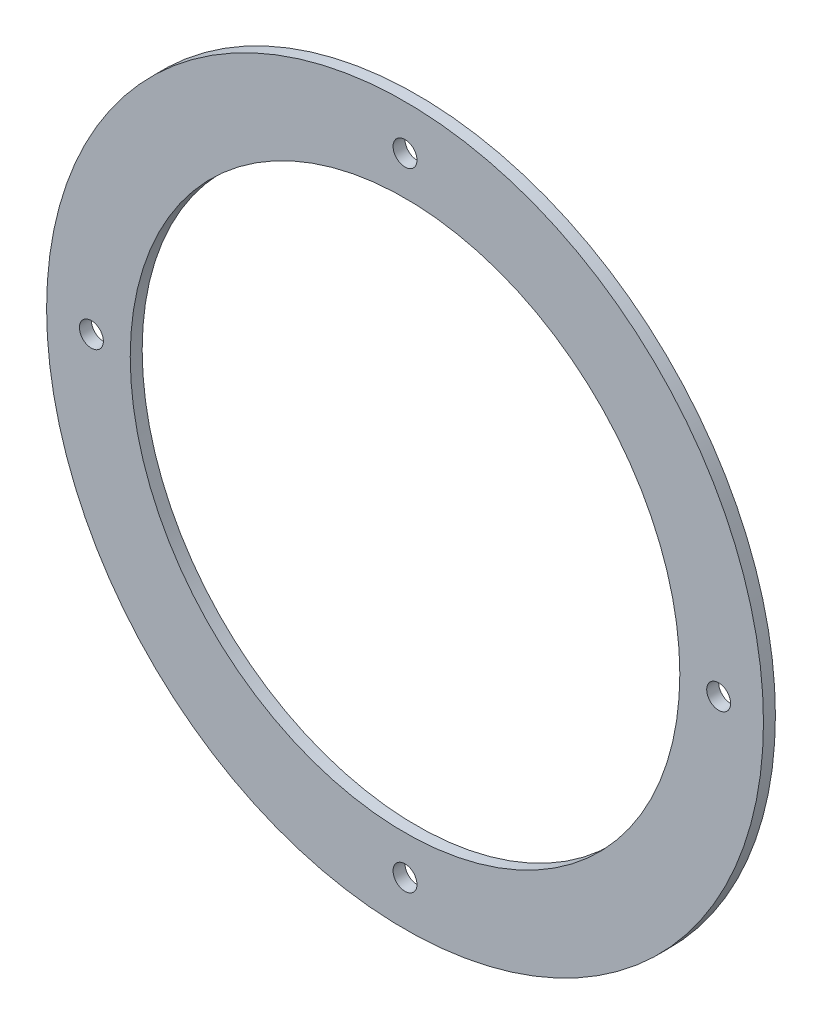
ISO-10303-21;
HEADER;
FILE_DESCRIPTION(('STEP AP214'),'2;1');
FILE_NAME('part.step','',(''),(''),'','','');
FILE_SCHEMA(('AUTOMOTIVE_DESIGN { 1 0 10303 214 1 1 1 1 }'));
ENDSEC;
DATA;
#1=APPLICATION_CONTEXT('core data for automotive mechanical design processes');
#2=APPLICATION_PROTOCOL_DEFINITION('international standard','automotive_design',2000,#1);
#3=PRODUCT_CONTEXT('',#1,'mechanical');
#4=PRODUCT('Part','Part','',(#3));
#5=PRODUCT_RELATED_PRODUCT_CATEGORY('part','',(#4));
#6=PRODUCT_DEFINITION_FORMATION('','',#4);
#7=PRODUCT_DEFINITION_CONTEXT('part definition',#1,'design');
#8=PRODUCT_DEFINITION('design','',#6,#7);
#9=PRODUCT_DEFINITION_SHAPE('','',#8);
#10=(LENGTH_UNIT() NAMED_UNIT(*) SI_UNIT(.MILLI.,.METRE.));
#11=(NAMED_UNIT(*) PLANE_ANGLE_UNIT() SI_UNIT($,.RADIAN.));
#12=(NAMED_UNIT(*) SI_UNIT($,.STERADIAN.) SOLID_ANGLE_UNIT());
#13=UNCERTAINTY_MEASURE_WITH_UNIT(LENGTH_MEASURE(1.E-05),#10,'distance_accuracy_value','');
#14=(GEOMETRIC_REPRESENTATION_CONTEXT(3) GLOBAL_UNCERTAINTY_ASSIGNED_CONTEXT((#13)) GLOBAL_UNIT_ASSIGNED_CONTEXT((#10,
#11,#12)) REPRESENTATION_CONTEXT('',''));
#15=CARTESIAN_POINT('',(0.,0.,0.));
#16=DIRECTION('',(0.,0.,1.));
#17=DIRECTION('',(1.,0.,0.));
#18=AXIS2_PLACEMENT_3D('',#15,#16,#17);
#19=CARTESIAN_POINT('',(0.,0.,2.));
#20=DIRECTION('',(0.,0.,1.));
#21=DIRECTION('',(1.,0.,0.));
#22=AXIS2_PLACEMENT_3D('',#19,#20,#21);
#23=PLANE('',#22);
#24=CARTESIAN_POINT('',(0.,-52.5,2.));
#25=DIRECTION('',(0.,0.,1.));
#26=DIRECTION('',(1.,0.,0.));
#27=AXIS2_PLACEMENT_3D('',#24,#25,#26);
#28=CIRCLE('',#27,2.);
#29=CARTESIAN_POINT('',(2.00000000000001,-52.5,2.));
#30=VERTEX_POINT('',#29);
#31=EDGE_CURVE('E63',#30,#30,#28,.T.);
#32=ORIENTED_EDGE('',*,*,#31,.F.);
#33=EDGE_LOOP('',(#32));
#34=FACE_BOUND('',#33,.T.);
#35=CARTESIAN_POINT('',(0.,52.5,2.));
#36=DIRECTION('',(0.,0.,1.));
#37=DIRECTION('',(1.,0.,0.));
#38=AXIS2_PLACEMENT_3D('',#35,#36,#37);
#39=CIRCLE('',#38,2.);
#40=CARTESIAN_POINT('',(2.,52.5,2.));
#41=VERTEX_POINT('',#40);
#42=EDGE_CURVE('E51',#41,#41,#39,.T.);
#43=ORIENTED_EDGE('',*,*,#42,.F.);
#44=EDGE_LOOP('',(#43));
#45=FACE_BOUND('',#44,.T.);
#46=CARTESIAN_POINT('',(-52.5,0.,2.));
#47=DIRECTION('',(0.,0.,1.));
#48=DIRECTION('',(1.,0.,0.));
#49=AXIS2_PLACEMENT_3D('',#46,#47,#48);
#50=CIRCLE('',#49,2.);
#51=CARTESIAN_POINT('',(-50.5,0.,2.));
#52=VERTEX_POINT('',#51);
#53=EDGE_CURVE('E11',#52,#52,#50,.T.);
#54=ORIENTED_EDGE('',*,*,#53,.F.);
#55=EDGE_LOOP('',(#54));
#56=FACE_BOUND('',#55,.T.);
#57=CARTESIAN_POINT('',(0.,0.,2.));
#58=DIRECTION('',(0.,0.,1.));
#59=DIRECTION('',(1.,0.,0.));
#60=AXIS2_PLACEMENT_3D('',#57,#58,#59);
#61=CIRCLE('',#60,46.);
#62=CARTESIAN_POINT('',(46.,0.,2.));
#63=VERTEX_POINT('',#62);
#64=EDGE_CURVE('E46',#63,#63,#61,.T.);
#65=ORIENTED_EDGE('',*,*,#64,.F.);
#66=EDGE_LOOP('',(#65));
#67=FACE_BOUND('',#66,.T.);
#68=CARTESIAN_POINT('',(52.5,0.,2.));
#69=DIRECTION('',(0.,0.,1.));
#70=DIRECTION('',(1.,0.,0.));
#71=AXIS2_PLACEMENT_3D('',#68,#69,#70);
#72=CIRCLE('',#71,2.);
#73=CARTESIAN_POINT('',(54.5,0.,2.));
#74=VERTEX_POINT('',#73);
#75=EDGE_CURVE('E57',#74,#74,#72,.T.);
#76=ORIENTED_EDGE('',*,*,#75,.F.);
#77=EDGE_LOOP('',(#76));
#78=FACE_BOUND('',#77,.T.);
#79=CARTESIAN_POINT('',(0.,0.,2.));
#80=DIRECTION('',(0.,0.,1.));
#81=DIRECTION('',(1.,0.,0.));
#82=AXIS2_PLACEMENT_3D('',#79,#80,#81);
#83=CIRCLE('',#82,60.);
#84=CARTESIAN_POINT('',(60.,0.,2.));
#85=VERTEX_POINT('',#84);
#86=EDGE_CURVE('E71',#85,#85,#83,.T.);
#87=ORIENTED_EDGE('',*,*,#86,.T.);
#88=EDGE_LOOP('',(#87));
#89=FACE_BOUND('',#88,.T.);
#90=ADVANCED_FACE('F33',(#34,#45,#56,#67,#78,#89),#23,.T.);
#91=CARTESIAN_POINT('',(0.,0.,0.));
#92=DIRECTION('',(0.,0.,1.));
#93=DIRECTION('',(1.,0.,0.));
#94=AXIS2_PLACEMENT_3D('',#91,#92,#93);
#95=PLANE('',#94);
#96=CARTESIAN_POINT('',(0.,-52.5,0.));
#97=DIRECTION('',(0.,0.,1.));
#98=DIRECTION('',(1.,0.,0.));
#99=AXIS2_PLACEMENT_3D('',#96,#97,#98);
#100=CIRCLE('',#99,2.);
#101=CARTESIAN_POINT('',(2.00000000000001,-52.5,0.));
#102=VERTEX_POINT('',#101);
#103=EDGE_CURVE('E66',#102,#102,#100,.T.);
#104=ORIENTED_EDGE('',*,*,#103,.T.);
#105=EDGE_LOOP('',(#104));
#106=FACE_BOUND('',#105,.T.);
#107=CARTESIAN_POINT('',(52.5,0.,0.));
#108=DIRECTION('',(0.,0.,1.));
#109=DIRECTION('',(1.,0.,0.));
#110=AXIS2_PLACEMENT_3D('',#107,#108,#109);
#111=CIRCLE('',#110,2.);
#112=CARTESIAN_POINT('',(54.5,0.,0.));
#113=VERTEX_POINT('',#112);
#114=EDGE_CURVE('E60',#113,#113,#111,.T.);
#115=ORIENTED_EDGE('',*,*,#114,.T.);
#116=EDGE_LOOP('',(#115));
#117=FACE_BOUND('',#116,.T.);
#118=CARTESIAN_POINT('',(0.,52.5,0.));
#119=DIRECTION('',(0.,0.,1.));
#120=DIRECTION('',(1.,0.,0.));
#121=AXIS2_PLACEMENT_3D('',#118,#119,#120);
#122=CIRCLE('',#121,2.);
#123=CARTESIAN_POINT('',(2.,52.5,0.));
#124=VERTEX_POINT('',#123);
#125=EDGE_CURVE('E54',#124,#124,#122,.T.);
#126=ORIENTED_EDGE('',*,*,#125,.T.);
#127=EDGE_LOOP('',(#126));
#128=FACE_BOUND('',#127,.T.);
#129=CARTESIAN_POINT('',(0.,0.,0.));
#130=DIRECTION('',(0.,0.,1.));
#131=DIRECTION('',(1.,0.,0.));
#132=AXIS2_PLACEMENT_3D('',#129,#130,#131);
#133=CIRCLE('',#132,46.);
#134=CARTESIAN_POINT('',(46.,0.,0.));
#135=VERTEX_POINT('',#134);
#136=EDGE_CURVE('E48',#135,#135,#133,.T.);
#137=ORIENTED_EDGE('',*,*,#136,.T.);
#138=EDGE_LOOP('',(#137));
#139=FACE_BOUND('',#138,.T.);
#140=CARTESIAN_POINT('',(-52.5,0.,0.));
#141=DIRECTION('',(0.,0.,1.));
#142=DIRECTION('',(1.,0.,0.));
#143=AXIS2_PLACEMENT_3D('',#140,#141,#142);
#144=CIRCLE('',#143,2.);
#145=CARTESIAN_POINT('',(-50.5,0.,0.));
#146=VERTEX_POINT('',#145);
#147=EDGE_CURVE('E41',#146,#146,#144,.T.);
#148=ORIENTED_EDGE('',*,*,#147,.T.);
#149=EDGE_LOOP('',(#148));
#150=FACE_BOUND('',#149,.T.);
#151=CARTESIAN_POINT('',(0.,0.,0.));
#152=DIRECTION('',(0.,0.,1.));
#153=DIRECTION('',(1.,0.,0.));
#154=AXIS2_PLACEMENT_3D('',#151,#152,#153);
#155=CIRCLE('',#154,60.);
#156=CARTESIAN_POINT('',(60.,0.,0.));
#157=VERTEX_POINT('',#156);
#158=EDGE_CURVE('E37',#157,#157,#155,.T.);
#159=ORIENTED_EDGE('',*,*,#158,.F.);
#160=EDGE_LOOP('',(#159));
#161=FACE_BOUND('',#160,.T.);
#162=ADVANCED_FACE('F35',(#106,#117,#128,#139,#150,#161),#95,.F.);
#163=CARTESIAN_POINT('',(-52.5,0.,2.));
#164=DIRECTION('',(0.,0.,-1.));
#165=DIRECTION('',(-1.,0.,0.));
#166=AXIS2_PLACEMENT_3D('',#163,#164,#165);
#167=CYLINDRICAL_SURFACE('',#166,2.);
#168=ORIENTED_EDGE('',*,*,#53,.T.);
#169=EDGE_LOOP('',(#168));
#170=FACE_BOUND('',#169,.T.);
#171=ORIENTED_EDGE('',*,*,#147,.F.);
#172=EDGE_LOOP('',(#171));
#173=FACE_BOUND('',#172,.T.);
#174=ADVANCED_FACE('F81',(#170,#173),#167,.F.);
#175=CARTESIAN_POINT('',(0.,0.,2.));
#176=DIRECTION('',(0.,0.,-1.));
#177=DIRECTION('',(-1.,0.,0.));
#178=AXIS2_PLACEMENT_3D('',#175,#176,#177);
#179=CYLINDRICAL_SURFACE('',#178,46.);
#180=ORIENTED_EDGE('',*,*,#64,.T.);
#181=EDGE_LOOP('',(#180));
#182=FACE_BOUND('',#181,.T.);
#183=ORIENTED_EDGE('',*,*,#136,.F.);
#184=EDGE_LOOP('',(#183));
#185=FACE_BOUND('',#184,.T.);
#186=ADVANCED_FACE('F87',(#182,#185),#179,.F.);
#187=CARTESIAN_POINT('',(0.,52.5,2.));
#188=DIRECTION('',(0.,0.,-1.));
#189=DIRECTION('',(-1.,0.,0.));
#190=AXIS2_PLACEMENT_3D('',#187,#188,#189);
#191=CYLINDRICAL_SURFACE('',#190,2.);
#192=ORIENTED_EDGE('',*,*,#42,.T.);
#193=EDGE_LOOP('',(#192));
#194=FACE_BOUND('',#193,.T.);
#195=ORIENTED_EDGE('',*,*,#125,.F.);
#196=EDGE_LOOP('',(#195));
#197=FACE_BOUND('',#196,.T.);
#198=ADVANCED_FACE('F102',(#194,#197),#191,.F.);
#199=CARTESIAN_POINT('',(52.5,0.,2.));
#200=DIRECTION('',(0.,0.,-1.));
#201=DIRECTION('',(-1.,0.,0.));
#202=AXIS2_PLACEMENT_3D('',#199,#200,#201);
#203=CYLINDRICAL_SURFACE('',#202,2.);
#204=ORIENTED_EDGE('',*,*,#75,.T.);
#205=EDGE_LOOP('',(#204));
#206=FACE_BOUND('',#205,.T.);
#207=ORIENTED_EDGE('',*,*,#114,.F.);
#208=EDGE_LOOP('',(#207));
#209=FACE_BOUND('',#208,.T.);
#210=ADVANCED_FACE('F108',(#206,#209),#203,.F.);
#211=CARTESIAN_POINT('',(0.,-52.5,2.));
#212=DIRECTION('',(0.,0.,-1.));
#213=DIRECTION('',(-1.,0.,0.));
#214=AXIS2_PLACEMENT_3D('',#211,#212,#213);
#215=CYLINDRICAL_SURFACE('',#214,2.);
#216=ORIENTED_EDGE('',*,*,#31,.T.);
#217=EDGE_LOOP('',(#216));
#218=FACE_BOUND('',#217,.T.);
#219=ORIENTED_EDGE('',*,*,#103,.F.);
#220=EDGE_LOOP('',(#219));
#221=FACE_BOUND('',#220,.T.);
#222=ADVANCED_FACE('F114',(#218,#221),#215,.F.);
#223=CARTESIAN_POINT('',(0.,0.,-8.));
#224=DIRECTION('',(0.,0.,1.));
#225=DIRECTION('',(1.,0.,0.));
#226=AXIS2_PLACEMENT_3D('',#223,#224,#225);
#227=CYLINDRICAL_SURFACE('',#226,60.);
#228=ORIENTED_EDGE('',*,*,#86,.F.);
#229=EDGE_LOOP('',(#228));
#230=FACE_BOUND('',#229,.T.);
#231=ORIENTED_EDGE('',*,*,#158,.T.);
#232=EDGE_LOOP('',(#231));
#233=FACE_BOUND('',#232,.T.);
#234=ADVANCED_FACE('F78',(#230,#233),#227,.T.);
#235=CLOSED_SHELL('',(#90,#162,#174,#186,#198,#210,#222,#234));
#236=MANIFOLD_SOLID_BREP('B2',#235);
#237=ADVANCED_BREP_SHAPE_REPRESENTATION('',(#18,#236),#14);
#238=SHAPE_DEFINITION_REPRESENTATION(#9,#237);
ENDSEC;
END-ISO-10303-21;
